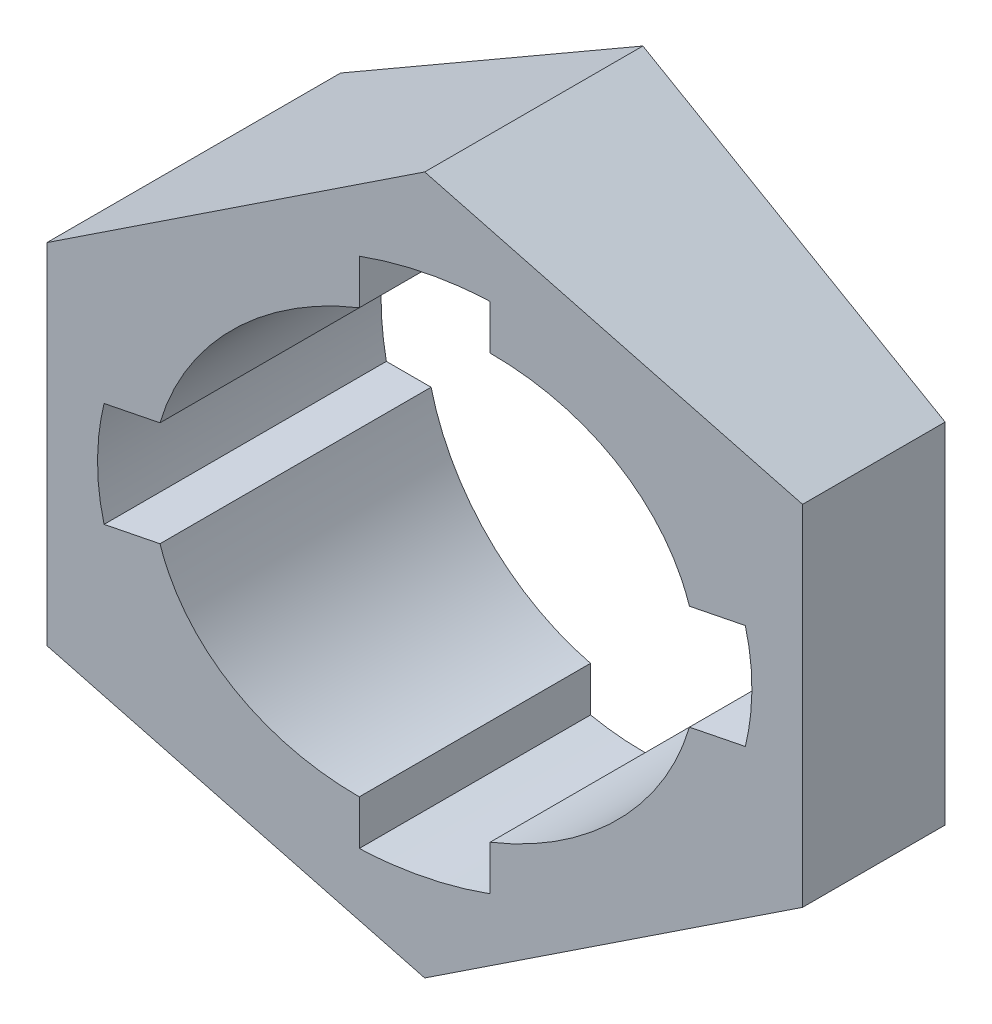
ISO-10303-21;
HEADER;
FILE_DESCRIPTION(('STEP AP214'),'2;1');
FILE_NAME('part.step','',(''),(''),'','','');
FILE_SCHEMA(('AUTOMOTIVE_DESIGN { 1 0 10303 214 1 1 1 1 }'));
ENDSEC;
DATA;
#1=APPLICATION_CONTEXT('core data for automotive mechanical design processes');
#2=APPLICATION_PROTOCOL_DEFINITION('international standard','automotive_design',2000,#1);
#3=PRODUCT_CONTEXT('',#1,'mechanical');
#4=PRODUCT('Part','Part','',(#3));
#5=PRODUCT_RELATED_PRODUCT_CATEGORY('part','',(#4));
#6=PRODUCT_DEFINITION_FORMATION('','',#4);
#7=PRODUCT_DEFINITION_CONTEXT('part definition',#1,'design');
#8=PRODUCT_DEFINITION('design','',#6,#7);
#9=PRODUCT_DEFINITION_SHAPE('','',#8);
#10=(LENGTH_UNIT() NAMED_UNIT(*) SI_UNIT(.MILLI.,.METRE.));
#11=(NAMED_UNIT(*) PLANE_ANGLE_UNIT() SI_UNIT($,.RADIAN.));
#12=(NAMED_UNIT(*) SI_UNIT($,.STERADIAN.) SOLID_ANGLE_UNIT());
#13=UNCERTAINTY_MEASURE_WITH_UNIT(LENGTH_MEASURE(1.E-05),#10,'distance_accuracy_value','');
#14=(GEOMETRIC_REPRESENTATION_CONTEXT(3) GLOBAL_UNCERTAINTY_ASSIGNED_CONTEXT((#13)) GLOBAL_UNIT_ASSIGNED_CONTEXT((#10,
#11,#12)) REPRESENTATION_CONTEXT('',''));
#15=CARTESIAN_POINT('',(0.,0.,0.));
#16=DIRECTION('',(0.,0.,1.));
#17=DIRECTION('',(1.,0.,0.));
#18=AXIS2_PLACEMENT_3D('',#15,#16,#17);
#19=CARTESIAN_POINT('',(0.,0.,0.));
#20=DIRECTION('',(0.,0.,-1.));
#21=DIRECTION('',(-1.,0.,0.));
#22=AXIS2_PLACEMENT_3D('',#19,#20,#21);
#23=PLANE('',#22);
#24=DIRECTION('',(0.,-1.,0.));
#25=VECTOR('',#24,1.);
#26=CARTESIAN_POINT('',(-34.0000000000001,0.,0.));
#27=LINE('',#26,#25);
#28=CARTESIAN_POINT('',(-34.,69.393876913398,0.));
#29=VERTEX_POINT('',#28);
#30=CARTESIAN_POINT('',(-34.,64.2693221990231,0.));
#31=VERTEX_POINT('',#30);
#32=EDGE_CURVE('E215',#29,#31,#27,.T.);
#33=ORIENTED_EDGE('',*,*,#32,.F.);
#34=CARTESIAN_POINT('',(-40.,39.9999999999999,0.));
#35=DIRECTION('',(0.,0.,-1.));
#36=DIRECTION('',(-1.,0.,0.));
#37=AXIS2_PLACEMENT_3D('',#34,#35,#36);
#38=CIRCLE('',#37,30.);
#39=CARTESIAN_POINT('',(-46.,69.393876913398,0.));
#40=VERTEX_POINT('',#39);
#41=EDGE_CURVE('E437',#40,#29,#38,.T.);
#42=ORIENTED_EDGE('',*,*,#41,.F.);
#43=DIRECTION('',(0.,-1.,0.));
#44=VECTOR('',#43,1.);
#45=CARTESIAN_POINT('',(-46.0000000000001,0.,0.));
#46=LINE('',#45,#44);
#47=CARTESIAN_POINT('',(-46.,64.2693221990231,0.));
#48=VERTEX_POINT('',#47);
#49=EDGE_CURVE('E434',#40,#48,#46,.T.);
#50=ORIENTED_EDGE('',*,*,#49,.T.);
#51=CARTESIAN_POINT('',(-40.,39.9999999999999,0.));
#52=DIRECTION('',(0.,0.,-1.));
#53=DIRECTION('',(-1.,0.,0.));
#54=AXIS2_PLACEMENT_3D('',#51,#52,#53);
#55=CIRCLE('',#54,25.);
#56=CARTESIAN_POINT('',(-64.2693221990232,45.9999999999999,0.));
#57=VERTEX_POINT('',#56);
#58=EDGE_CURVE('E431',#57,#48,#55,.T.);
#59=ORIENTED_EDGE('',*,*,#58,.F.);
#60=DIRECTION('',(1.,0.,0.));
#61=VECTOR('',#60,1.);
#62=CARTESIAN_POINT('',(0.,45.9999999999998,0.));
#63=LINE('',#62,#61);
#64=CARTESIAN_POINT('',(-69.3938769133981,45.9999999999999,0.));
#65=VERTEX_POINT('',#64);
#66=EDGE_CURVE('E428',#65,#57,#63,.T.);
#67=ORIENTED_EDGE('',*,*,#66,.F.);
#68=CARTESIAN_POINT('',(-40.,39.9999999999999,0.));
#69=DIRECTION('',(0.,0.,-1.));
#70=DIRECTION('',(-1.,0.,0.));
#71=AXIS2_PLACEMENT_3D('',#68,#69,#70);
#72=CIRCLE('',#71,30.);
#73=CARTESIAN_POINT('',(-69.3938769133981,33.9999999999999,0.));
#74=VERTEX_POINT('',#73);
#75=EDGE_CURVE('E425',#74,#65,#72,.T.);
#76=ORIENTED_EDGE('',*,*,#75,.F.);
#77=DIRECTION('',(1.,0.,0.));
#78=VECTOR('',#77,1.);
#79=CARTESIAN_POINT('',(0.,33.9999999999997,0.));
#80=LINE('',#79,#78);
#81=CARTESIAN_POINT('',(-64.2693221990232,33.9999999999999,0.));
#82=VERTEX_POINT('',#81);
#83=EDGE_CURVE('E422',#74,#82,#80,.T.);
#84=ORIENTED_EDGE('',*,*,#83,.T.);
#85=CARTESIAN_POINT('',(-40.,39.9999999999999,0.));
#86=DIRECTION('',(0.,0.,-1.));
#87=DIRECTION('',(-1.,0.,0.));
#88=AXIS2_PLACEMENT_3D('',#85,#86,#87);
#89=CIRCLE('',#88,25.);
#90=CARTESIAN_POINT('',(-46.,15.7306778009767,0.));
#91=VERTEX_POINT('',#90);
#92=EDGE_CURVE('E419',#91,#82,#89,.T.);
#93=ORIENTED_EDGE('',*,*,#92,.F.);
#94=DIRECTION('',(0.,1.,0.));
#95=VECTOR('',#94,1.);
#96=CARTESIAN_POINT('',(-46.,0.,0.));
#97=LINE('',#96,#95);
#98=CARTESIAN_POINT('',(-46.,10.6061230866017,0.));
#99=VERTEX_POINT('',#98);
#100=EDGE_CURVE('E416',#99,#91,#97,.T.);
#101=ORIENTED_EDGE('',*,*,#100,.F.);
#102=CARTESIAN_POINT('',(-40.,39.9999999999999,0.));
#103=DIRECTION('',(0.,0.,-1.));
#104=DIRECTION('',(-1.,0.,0.));
#105=AXIS2_PLACEMENT_3D('',#102,#103,#104);
#106=CIRCLE('',#105,30.);
#107=CARTESIAN_POINT('',(-34.,10.6061230866017,0.));
#108=VERTEX_POINT('',#107);
#109=EDGE_CURVE('E413',#108,#99,#106,.T.);
#110=ORIENTED_EDGE('',*,*,#109,.F.);
#111=DIRECTION('',(0.,1.,0.));
#112=VECTOR('',#111,1.);
#113=CARTESIAN_POINT('',(-34.0000000000001,1.84150550346205E-13,0.));
#114=LINE('',#113,#112);
#115=CARTESIAN_POINT('',(-34.,15.7306778009767,0.));
#116=VERTEX_POINT('',#115);
#117=EDGE_CURVE('E410',#108,#116,#114,.T.);
#118=ORIENTED_EDGE('',*,*,#117,.T.);
#119=CARTESIAN_POINT('',(-40.,39.9999999999999,0.));
#120=DIRECTION('',(0.,0.,-1.));
#121=DIRECTION('',(-1.,0.,0.));
#122=AXIS2_PLACEMENT_3D('',#119,#120,#121);
#123=CIRCLE('',#122,25.);
#124=CARTESIAN_POINT('',(-15.7306778009768,33.9999999999999,0.));
#125=VERTEX_POINT('',#124);
#126=EDGE_CURVE('E407',#125,#116,#123,.T.);
#127=ORIENTED_EDGE('',*,*,#126,.F.);
#128=DIRECTION('',(-1.,0.,0.));
#129=VECTOR('',#128,1.);
#130=CARTESIAN_POINT('',(0.,33.9999999999998,0.));
#131=LINE('',#130,#129);
#132=CARTESIAN_POINT('',(-10.6061230866019,33.9999999999999,0.));
#133=VERTEX_POINT('',#132);
#134=EDGE_CURVE('E404',#133,#125,#131,.T.);
#135=ORIENTED_EDGE('',*,*,#134,.F.);
#136=CARTESIAN_POINT('',(-40.,39.9999999999999,0.));
#137=DIRECTION('',(0.,0.,-1.));
#138=DIRECTION('',(-1.,0.,0.));
#139=AXIS2_PLACEMENT_3D('',#136,#137,#138);
#140=CIRCLE('',#139,30.);
#141=CARTESIAN_POINT('',(-10.6061230866019,45.9999999999999,0.));
#142=VERTEX_POINT('',#141);
#143=EDGE_CURVE('E401',#142,#133,#140,.T.);
#144=ORIENTED_EDGE('',*,*,#143,.F.);
#145=DIRECTION('',(-1.,0.,0.));
#146=VECTOR('',#145,1.);
#147=CARTESIAN_POINT('',(0.,45.9999999999999,0.));
#148=LINE('',#147,#146);
#149=CARTESIAN_POINT('',(-15.7306778009768,45.9999999999999,0.));
#150=VERTEX_POINT('',#149);
#151=EDGE_CURVE('E398',#142,#150,#148,.T.);
#152=ORIENTED_EDGE('',*,*,#151,.T.);
#153=CARTESIAN_POINT('',(-40.,39.9999999999999,0.));
#154=DIRECTION('',(0.,0.,-1.));
#155=DIRECTION('',(-1.,0.,0.));
#156=AXIS2_PLACEMENT_3D('',#153,#154,#155);
#157=CIRCLE('',#156,25.);
#158=EDGE_CURVE('E395',#31,#150,#157,.T.);
#159=ORIENTED_EDGE('',*,*,#158,.F.);
#160=EDGE_LOOP('',(#33,#42,#50,#59,#67,#76,#84,#93,#101,#110,#118,#127,#135,#144,#152,#159));
#161=FACE_BOUND('',#160,.T.);
#162=DIRECTION('',(0.,1.,0.));
#163=VECTOR('',#162,1.);
#164=CARTESIAN_POINT('',(-74.6410161513776,0.,0.));
#165=LINE('',#164,#163);
#166=CARTESIAN_POINT('',(-74.6410161513776,19.9999999999999,0.));
#167=VERTEX_POINT('',#166);
#168=CARTESIAN_POINT('',(-74.6410161513776,60.,0.));
#169=VERTEX_POINT('',#168);
#170=EDGE_CURVE('E354',#167,#169,#165,.T.);
#171=ORIENTED_EDGE('',*,*,#170,.T.);
#172=DIRECTION('',(0.866025403784439,0.5,0.));
#173=VECTOR('',#172,1.);
#174=CARTESIAN_POINT('',(-44.6410161513775,77.3205080756888,0.));
#175=LINE('',#174,#173);
#176=CARTESIAN_POINT('',(-40.,80.,0.));
#177=VERTEX_POINT('',#176);
#178=EDGE_CURVE('E363',#169,#177,#175,.T.);
#179=ORIENTED_EDGE('',*,*,#178,.T.);
#180=DIRECTION('',(0.866025403784438,-0.5,0.));
#181=VECTOR('',#180,1.);
#182=CARTESIAN_POINT('',(24.6410161513775,42.6794919243112,0.));
#183=LINE('',#182,#181);
#184=CARTESIAN_POINT('',(-5.35898384862239,59.9999999999999,0.));
#185=VERTEX_POINT('',#184);
#186=EDGE_CURVE('E385',#177,#185,#183,.T.);
#187=ORIENTED_EDGE('',*,*,#186,.T.);
#188=DIRECTION('',(0.,-1.,0.));
#189=VECTOR('',#188,1.);
#190=CARTESIAN_POINT('',(-5.3589838486224,0.,0.));
#191=LINE('',#190,#189);
#192=CARTESIAN_POINT('',(-5.3589838486224,19.9999999999999,0.));
#193=VERTEX_POINT('',#192);
#194=EDGE_CURVE('E382',#185,#193,#191,.T.);
#195=ORIENTED_EDGE('',*,*,#194,.T.);
#196=DIRECTION('',(-0.866025403784439,-0.5,0.));
#197=VECTOR('',#196,1.);
#198=CARTESIAN_POINT('',(-9.99999999999993,17.3205080756887,0.));
#199=LINE('',#198,#197);
#200=CARTESIAN_POINT('',(-39.9999999999998,0.,0.));
#201=VERTEX_POINT('',#200);
#202=EDGE_CURVE('E380',#193,#201,#199,.T.);
#203=ORIENTED_EDGE('',*,*,#202,.T.);
#204=DIRECTION('',(-0.866025403784439,0.5,0.));
#205=VECTOR('',#204,1.);
#206=CARTESIAN_POINT('',(-10.0000000000001,-17.3205080756889,0.));
#207=LINE('',#206,#205);
#208=EDGE_CURVE('E360',#201,#167,#207,.T.);
#209=ORIENTED_EDGE('',*,*,#208,.T.);
#210=EDGE_LOOP('',(#171,#179,#187,#195,#203,#209));
#211=FACE_BOUND('',#210,.T.);
#212=ADVANCED_FACE('F201',(#161,#211),#23,.T.);
#213=CARTESIAN_POINT('',(-80.,80.001,35.));
#214=DIRECTION('',(-0.242535625036333,0.,-0.970142500145332));
#215=DIRECTION('',(-0.970142500145332,0.,0.242535625036333));
#216=AXIS2_PLACEMENT_3D('',#213,#214,#215);
#217=PLANE('',#216);
#218=CARTESIAN_POINT('',(-40.,39.9999999999999,25.));
#219=DIRECTION('',(-0.242535625036333,0.,-0.970142500145332));
#220=DIRECTION('',(0.970142500145332,0.,-0.242535625036333));
#221=AXIS2_PLACEMENT_3D('',#218,#219,#220);
#222=ELLIPSE('',#221,30.9232921921325,30.);
#223=CARTESIAN_POINT('',(-46.,69.393876913398,26.5));
#224=VERTEX_POINT('',#223);
#225=CARTESIAN_POINT('',(-34.,69.393876913398,23.5));
#226=VERTEX_POINT('',#225);
#227=EDGE_CURVE('E511',#224,#226,#222,.T.);
#228=ORIENTED_EDGE('',*,*,#227,.T.);
#229=DIRECTION('',(0.,-1.,0.));
#230=VECTOR('',#229,1.);
#231=CARTESIAN_POINT('',(-34.,80.0009999999999,23.5));
#232=LINE('',#231,#230);
#233=CARTESIAN_POINT('',(-34.,64.2693221990231,23.5));
#234=VERTEX_POINT('',#233);
#235=EDGE_CURVE('E514',#226,#234,#232,.T.);
#236=ORIENTED_EDGE('',*,*,#235,.T.);
#237=CARTESIAN_POINT('',(-40.,39.9999999999999,25.));
#238=DIRECTION('',(-0.242535625036333,0.,-0.970142500145332));
#239=DIRECTION('',(0.970142500145332,0.,-0.242535625036333));
#240=AXIS2_PLACEMENT_3D('',#237,#238,#239);
#241=ELLIPSE('',#240,25.7694101601104,25.);
#242=CARTESIAN_POINT('',(-15.7306778009768,45.9999999999999,18.9326694502442));
#243=VERTEX_POINT('',#242);
#244=EDGE_CURVE('E443',#234,#243,#241,.T.);
#245=ORIENTED_EDGE('',*,*,#244,.T.);
#246=DIRECTION('',(-0.970142500145332,0.,0.242535625036333));
#247=VECTOR('',#246,1.);
#248=CARTESIAN_POINT('',(-80.,46.,35.));
#249=LINE('',#248,#247);
#250=CARTESIAN_POINT('',(-10.6061230866019,45.9999999999999,17.6515307716505));
#251=VERTEX_POINT('',#250);
#252=EDGE_CURVE('E475',#251,#243,#249,.T.);
#253=ORIENTED_EDGE('',*,*,#252,.F.);
#254=CARTESIAN_POINT('',(-40.,39.9999999999999,25.));
#255=DIRECTION('',(-0.242535625036333,0.,-0.970142500145332));
#256=DIRECTION('',(0.970142500145332,0.,-0.242535625036333));
#257=AXIS2_PLACEMENT_3D('',#254,#255,#256);
#258=ELLIPSE('',#257,30.9232921921325,30.);
#259=CARTESIAN_POINT('',(-10.6061230866019,33.9999999999999,17.6515307716505));
#260=VERTEX_POINT('',#259);
#261=EDGE_CURVE('E478',#251,#260,#258,.T.);
#262=ORIENTED_EDGE('',*,*,#261,.T.);
#263=DIRECTION('',(-0.970142500145332,0.,0.242535625036333));
#264=VECTOR('',#263,1.);
#265=CARTESIAN_POINT('',(-80.0000000000001,34.0000000000001,35.));
#266=LINE('',#265,#264);
#267=CARTESIAN_POINT('',(-15.7306778009768,33.9999999999999,18.9326694502442));
#268=VERTEX_POINT('',#267);
#269=EDGE_CURVE('E481',#260,#268,#266,.T.);
#270=ORIENTED_EDGE('',*,*,#269,.T.);
#271=CARTESIAN_POINT('',(-40.,39.9999999999999,25.));
#272=DIRECTION('',(-0.242535625036333,0.,-0.970142500145332));
#273=DIRECTION('',(0.970142500145332,0.,-0.242535625036333));
#274=AXIS2_PLACEMENT_3D('',#271,#272,#273);
#275=ELLIPSE('',#274,25.7694101601104,25.);
#276=CARTESIAN_POINT('',(-34.,15.7306778009767,23.5));
#277=VERTEX_POINT('',#276);
#278=EDGE_CURVE('E484',#268,#277,#275,.T.);
#279=ORIENTED_EDGE('',*,*,#278,.T.);
#280=DIRECTION('',(0.,1.,0.));
#281=VECTOR('',#280,1.);
#282=CARTESIAN_POINT('',(-33.9999999999997,80.0009999999997,23.4999999999999));
#283=LINE('',#282,#281);
#284=CARTESIAN_POINT('',(-34.,10.6061230866017,23.5));
#285=VERTEX_POINT('',#284);
#286=EDGE_CURVE('E487',#285,#277,#283,.T.);
#287=ORIENTED_EDGE('',*,*,#286,.F.);
#288=CARTESIAN_POINT('',(-40.,39.9999999999999,25.));
#289=DIRECTION('',(-0.242535625036333,0.,-0.970142500145332));
#290=DIRECTION('',(0.970142500145332,0.,-0.242535625036333));
#291=AXIS2_PLACEMENT_3D('',#288,#289,#290);
#292=ELLIPSE('',#291,30.9232921921325,30.);
#293=CARTESIAN_POINT('',(-46.,10.6061230866017,26.5));
#294=VERTEX_POINT('',#293);
#295=EDGE_CURVE('E489',#285,#294,#292,.T.);
#296=ORIENTED_EDGE('',*,*,#295,.T.);
#297=DIRECTION('',(0.,1.,0.));
#298=VECTOR('',#297,1.);
#299=CARTESIAN_POINT('',(-45.9999999999999,80.0009999999999,26.5));
#300=LINE('',#299,#298);
#301=CARTESIAN_POINT('',(-46.,15.7306778009767,26.5));
#302=VERTEX_POINT('',#301);
#303=EDGE_CURVE('E492',#294,#302,#300,.T.);
#304=ORIENTED_EDGE('',*,*,#303,.T.);
#305=CARTESIAN_POINT('',(-40.,39.9999999999999,25.));
#306=DIRECTION('',(-0.242535625036333,0.,-0.970142500145332));
#307=DIRECTION('',(0.970142500145332,0.,-0.242535625036333));
#308=AXIS2_PLACEMENT_3D('',#305,#306,#307);
#309=ELLIPSE('',#308,25.7694101601104,25.);
#310=CARTESIAN_POINT('',(-64.2693221990232,33.9999999999999,31.0673305497558));
#311=VERTEX_POINT('',#310);
#312=EDGE_CURVE('E495',#302,#311,#309,.T.);
#313=ORIENTED_EDGE('',*,*,#312,.T.);
#314=DIRECTION('',(0.970142500145332,0.,-0.242535625036333));
#315=VECTOR('',#314,1.);
#316=CARTESIAN_POINT('',(-80.0000000000001,33.9999999999999,35.));
#317=LINE('',#316,#315);
#318=CARTESIAN_POINT('',(-69.3938769133981,33.9999999999999,32.3484692283495));
#319=VERTEX_POINT('',#318);
#320=EDGE_CURVE('E498',#319,#311,#317,.T.);
#321=ORIENTED_EDGE('',*,*,#320,.F.);
#322=CARTESIAN_POINT('',(-40.,39.9999999999999,25.));
#323=DIRECTION('',(-0.242535625036333,0.,-0.970142500145332));
#324=DIRECTION('',(0.970142500145332,0.,-0.242535625036333));
#325=AXIS2_PLACEMENT_3D('',#322,#323,#324);
#326=ELLIPSE('',#325,30.9232921921324,30.);
#327=CARTESIAN_POINT('',(-69.3938769133981,45.9999999999999,32.3484692283495));
#328=VERTEX_POINT('',#327);
#329=EDGE_CURVE('E500',#319,#328,#326,.T.);
#330=ORIENTED_EDGE('',*,*,#329,.T.);
#331=DIRECTION('',(0.970142500145332,0.,-0.242535625036333));
#332=VECTOR('',#331,1.);
#333=CARTESIAN_POINT('',(-80.,45.9999999999999,35.));
#334=LINE('',#333,#332);
#335=CARTESIAN_POINT('',(-64.2693221990232,45.9999999999999,31.0673305497558));
#336=VERTEX_POINT('',#335);
#337=EDGE_CURVE('E503',#328,#336,#334,.T.);
#338=ORIENTED_EDGE('',*,*,#337,.T.);
#339=CARTESIAN_POINT('',(-40.,39.9999999999999,25.));
#340=DIRECTION('',(-0.242535625036333,0.,-0.970142500145332));
#341=DIRECTION('',(0.970142500145332,0.,-0.242535625036333));
#342=AXIS2_PLACEMENT_3D('',#339,#340,#341);
#343=ELLIPSE('',#342,25.7694101601104,25.);
#344=CARTESIAN_POINT('',(-46.,64.2693221990231,26.5));
#345=VERTEX_POINT('',#344);
#346=EDGE_CURVE('E506',#336,#345,#343,.T.);
#347=ORIENTED_EDGE('',*,*,#346,.T.);
#348=DIRECTION('',(0.,-1.,0.));
#349=VECTOR('',#348,1.);
#350=CARTESIAN_POINT('',(-46.,80.0009999999999,26.5));
#351=LINE('',#350,#349);
#352=EDGE_CURVE('E509',#224,#345,#351,.T.);
#353=ORIENTED_EDGE('',*,*,#352,.F.);
#354=EDGE_LOOP('',(#228,#236,#245,#253,#262,#270,#279,#287,#296,#304,#313,#321,#330,#338,#347,#353));
#355=FACE_BOUND('',#354,.T.);
#356=DIRECTION('',(0.846414739030318,0.488677777425221,-0.21160368475758));
#357=VECTOR('',#356,1.);
#358=CARTESIAN_POINT('',(-70.4473475699564,62.4212156843756,32.6118368924891));
#359=LINE('',#358,#357);
#360=CARTESIAN_POINT('',(-74.6410161513776,60.,33.6602540378444));
#361=VERTEX_POINT('',#360);
#362=CARTESIAN_POINT('',(-40.,80.,25.));
#363=VERTEX_POINT('',#362);
#364=EDGE_CURVE('E375',#361,#363,#359,.T.);
#365=ORIENTED_EDGE('',*,*,#364,.F.);
#366=DIRECTION('',(0.,1.,0.));
#367=VECTOR('',#366,1.);
#368=CARTESIAN_POINT('',(-74.6410161513776,80.001,33.6602540378444));
#369=LINE('',#368,#367);
#370=CARTESIAN_POINT('',(-74.6410161513776,19.9999999999999,33.6602540378444));
#371=VERTEX_POINT('',#370);
#372=EDGE_CURVE('E12',#371,#361,#369,.T.);
#373=ORIENTED_EDGE('',*,*,#372,.F.);
#374=DIRECTION('',(-0.846414739030318,0.488677777425221,0.21160368475758));
#375=VECTOR('',#374,1.);
#376=CARTESIAN_POINT('',(-103.538100694046,36.6837395395049,40.8845251735115));
#377=LINE('',#376,#375);
#378=CARTESIAN_POINT('',(-39.9999999999998,0.,24.9999999999999));
#379=VERTEX_POINT('',#378);
#380=EDGE_CURVE('E378',#379,#371,#377,.T.);
#381=ORIENTED_EDGE('',*,*,#380,.F.);
#382=DIRECTION('',(-0.846414739030318,-0.48867777742522,0.21160368475758));
#383=VECTOR('',#382,1.);
#384=CARTESIAN_POINT('',(-37.3574216940137,1.52569329631574,24.3393554235034));
#385=LINE('',#384,#383);
#386=CARTESIAN_POINT('',(-5.3589838486224,19.9999999999999,16.3397459621556));
#387=VERTEX_POINT('',#386);
#388=EDGE_CURVE('E208',#387,#379,#385,.T.);
#389=ORIENTED_EDGE('',*,*,#388,.F.);
#390=DIRECTION('',(0.,-1.,0.));
#391=VECTOR('',#390,1.);
#392=CARTESIAN_POINT('',(-5.35898384862238,80.001,16.3397459621556));
#393=LINE('',#392,#391);
#394=CARTESIAN_POINT('',(-5.35898384862238,59.9999999999999,16.3397459621556));
#395=VERTEX_POINT('',#394);
#396=EDGE_CURVE('E517',#395,#387,#393,.T.);
#397=ORIENTED_EDGE('',*,*,#396,.F.);
#398=DIRECTION('',(0.846414739030318,-0.488677777425221,-0.211603684757579));
#399=VECTOR('',#398,1.);
#400=CARTESIAN_POINT('',(-70.4481748181033,97.5792619275647,32.6120437045258));
#401=LINE('',#400,#399);
#402=EDGE_CURVE('E519',#363,#395,#401,.T.);
#403=ORIENTED_EDGE('',*,*,#402,.F.);
#404=EDGE_LOOP('',(#365,#373,#381,#389,#397,#403));
#405=FACE_BOUND('',#404,.T.);
#406=ADVANCED_FACE('F529',(#355,#405),#217,.F.);
#407=CARTESIAN_POINT('',(-34.0000000000001,0.,35.));
#408=DIRECTION('',(1.,0.,0.));
#409=DIRECTION('',(0.,1.,0.));
#410=AXIS2_PLACEMENT_3D('',#407,#408,#409);
#411=PLANE('',#410);
#412=DIRECTION('',(0.,0.,-1.));
#413=VECTOR('',#412,1.);
#414=CARTESIAN_POINT('',(-34.,69.393876913398,35.));
#415=LINE('',#414,#413);
#416=EDGE_CURVE('E441',#226,#29,#415,.T.);
#417=ORIENTED_EDGE('',*,*,#416,.T.);
#418=ORIENTED_EDGE('',*,*,#32,.T.);
#419=DIRECTION('',(0.,0.,-1.));
#420=VECTOR('',#419,1.);
#421=CARTESIAN_POINT('',(-34.,64.2693221990231,35.));
#422=LINE('',#421,#420);
#423=EDGE_CURVE('E440',#234,#31,#422,.T.);
#424=ORIENTED_EDGE('',*,*,#423,.F.);
#425=ORIENTED_EDGE('',*,*,#235,.F.);
#426=EDGE_LOOP('',(#417,#418,#424,#425));
#427=FACE_BOUND('',#426,.T.);
#428=ADVANCED_FACE('F547',(#427),#411,.F.);
#429=CARTESIAN_POINT('',(-40.,39.9999999999999,35.));
#430=DIRECTION('',(0.,0.,-1.));
#431=DIRECTION('',(-1.,0.,0.));
#432=AXIS2_PLACEMENT_3D('',#429,#430,#431);
#433=CYLINDRICAL_SURFACE('',#432,30.);
#434=DIRECTION('',(0.,0.,-1.));
#435=VECTOR('',#434,1.);
#436=CARTESIAN_POINT('',(-46.,69.393876913398,35.));
#437=LINE('',#436,#435);
#438=EDGE_CURVE('E444',#224,#40,#437,.T.);
#439=ORIENTED_EDGE('',*,*,#438,.T.);
#440=ORIENTED_EDGE('',*,*,#41,.T.);
#441=ORIENTED_EDGE('',*,*,#416,.F.);
#442=ORIENTED_EDGE('',*,*,#227,.F.);
#443=EDGE_LOOP('',(#439,#440,#441,#442));
#444=FACE_BOUND('',#443,.T.);
#445=ADVANCED_FACE('F560',(#444),#433,.F.);
#446=CARTESIAN_POINT('',(-46.0000000000001,0.,35.));
#447=DIRECTION('',(1.,0.,0.));
#448=DIRECTION('',(0.,1.,0.));
#449=AXIS2_PLACEMENT_3D('',#446,#447,#448);
#450=PLANE('',#449);
#451=ORIENTED_EDGE('',*,*,#352,.T.);
#452=DIRECTION('',(0.,0.,-1.));
#453=VECTOR('',#452,1.);
#454=CARTESIAN_POINT('',(-46.,64.2693221990231,35.));
#455=LINE('',#454,#453);
#456=EDGE_CURVE('E446',#345,#48,#455,.T.);
#457=ORIENTED_EDGE('',*,*,#456,.T.);
#458=ORIENTED_EDGE('',*,*,#49,.F.);
#459=ORIENTED_EDGE('',*,*,#438,.F.);
#460=EDGE_LOOP('',(#451,#457,#458,#459));
#461=FACE_BOUND('',#460,.T.);
#462=ADVANCED_FACE('F563',(#461),#450,.T.);
#463=CARTESIAN_POINT('',(-40.,39.9999999999999,35.));
#464=DIRECTION('',(0.,0.,-1.));
#465=DIRECTION('',(-1.,0.,0.));
#466=AXIS2_PLACEMENT_3D('',#463,#464,#465);
#467=CYLINDRICAL_SURFACE('',#466,25.);
#468=DIRECTION('',(0.,0.,-1.));
#469=VECTOR('',#468,1.);
#470=CARTESIAN_POINT('',(-64.2693221990232,45.9999999999999,35.));
#471=LINE('',#470,#469);
#472=EDGE_CURVE('E448',#336,#57,#471,.T.);
#473=ORIENTED_EDGE('',*,*,#472,.T.);
#474=ORIENTED_EDGE('',*,*,#58,.T.);
#475=ORIENTED_EDGE('',*,*,#456,.F.);
#476=ORIENTED_EDGE('',*,*,#346,.F.);
#477=EDGE_LOOP('',(#473,#474,#475,#476));
#478=FACE_BOUND('',#477,.T.);
#479=ADVANCED_FACE('F569',(#478),#467,.F.);
#480=CARTESIAN_POINT('',(0.,45.9999999999998,35.));
#481=DIRECTION('',(0.,1.,0.));
#482=DIRECTION('',(-1.,0.,0.));
#483=AXIS2_PLACEMENT_3D('',#480,#481,#482);
#484=PLANE('',#483);
#485=DIRECTION('',(0.,0.,-1.));
#486=VECTOR('',#485,1.);
#487=CARTESIAN_POINT('',(-69.3938769133981,45.9999999999999,35.));
#488=LINE('',#487,#486);
#489=EDGE_CURVE('E450',#328,#65,#488,.T.);
#490=ORIENTED_EDGE('',*,*,#489,.T.);
#491=ORIENTED_EDGE('',*,*,#66,.T.);
#492=ORIENTED_EDGE('',*,*,#472,.F.);
#493=ORIENTED_EDGE('',*,*,#337,.F.);
#494=EDGE_LOOP('',(#490,#491,#492,#493));
#495=FACE_BOUND('',#494,.T.);
#496=ADVANCED_FACE('F572',(#495),#484,.F.);
#497=CARTESIAN_POINT('',(-40.,39.9999999999999,35.));
#498=DIRECTION('',(0.,0.,-1.));
#499=DIRECTION('',(-1.,0.,0.));
#500=AXIS2_PLACEMENT_3D('',#497,#498,#499);
#501=CYLINDRICAL_SURFACE('',#500,30.);
#502=DIRECTION('',(0.,0.,-1.));
#503=VECTOR('',#502,1.);
#504=CARTESIAN_POINT('',(-69.3938769133981,33.9999999999999,35.));
#505=LINE('',#504,#503);
#506=EDGE_CURVE('E452',#319,#74,#505,.T.);
#507=ORIENTED_EDGE('',*,*,#506,.T.);
#508=ORIENTED_EDGE('',*,*,#75,.T.);
#509=ORIENTED_EDGE('',*,*,#489,.F.);
#510=ORIENTED_EDGE('',*,*,#329,.F.);
#511=EDGE_LOOP('',(#507,#508,#509,#510));
#512=FACE_BOUND('',#511,.T.);
#513=ADVANCED_FACE('F575',(#512),#501,.F.);
#514=CARTESIAN_POINT('',(0.,33.9999999999997,35.));
#515=DIRECTION('',(0.,1.,0.));
#516=DIRECTION('',(-1.,0.,0.));
#517=AXIS2_PLACEMENT_3D('',#514,#515,#516);
#518=PLANE('',#517);
#519=ORIENTED_EDGE('',*,*,#320,.T.);
#520=DIRECTION('',(0.,0.,-1.));
#521=VECTOR('',#520,1.);
#522=CARTESIAN_POINT('',(-64.2693221990232,33.9999999999999,35.));
#523=LINE('',#522,#521);
#524=EDGE_CURVE('E454',#311,#82,#523,.T.);
#525=ORIENTED_EDGE('',*,*,#524,.T.);
#526=ORIENTED_EDGE('',*,*,#83,.F.);
#527=ORIENTED_EDGE('',*,*,#506,.F.);
#528=EDGE_LOOP('',(#519,#525,#526,#527));
#529=FACE_BOUND('',#528,.T.);
#530=ADVANCED_FACE('F581',(#529),#518,.T.);
#531=CARTESIAN_POINT('',(-40.,39.9999999999999,35.));
#532=DIRECTION('',(0.,0.,-1.));
#533=DIRECTION('',(-1.,0.,0.));
#534=AXIS2_PLACEMENT_3D('',#531,#532,#533);
#535=CYLINDRICAL_SURFACE('',#534,25.);
#536=DIRECTION('',(0.,0.,-1.));
#537=VECTOR('',#536,1.);
#538=CARTESIAN_POINT('',(-46.,15.7306778009767,35.));
#539=LINE('',#538,#537);
#540=EDGE_CURVE('E456',#302,#91,#539,.T.);
#541=ORIENTED_EDGE('',*,*,#540,.T.);
#542=ORIENTED_EDGE('',*,*,#92,.T.);
#543=ORIENTED_EDGE('',*,*,#524,.F.);
#544=ORIENTED_EDGE('',*,*,#312,.F.);
#545=EDGE_LOOP('',(#541,#542,#543,#544));
#546=FACE_BOUND('',#545,.T.);
#547=ADVANCED_FACE('F585',(#546),#535,.F.);
#548=CARTESIAN_POINT('',(-46.,0.,35.));
#549=DIRECTION('',(-1.,0.,0.));
#550=DIRECTION('',(0.,-1.,0.));
#551=AXIS2_PLACEMENT_3D('',#548,#549,#550);
#552=PLANE('',#551);
#553=DIRECTION('',(0.,0.,-1.));
#554=VECTOR('',#553,1.);
#555=CARTESIAN_POINT('',(-46.,10.6061230866017,35.));
#556=LINE('',#555,#554);
#557=EDGE_CURVE('E458',#294,#99,#556,.T.);
#558=ORIENTED_EDGE('',*,*,#557,.T.);
#559=ORIENTED_EDGE('',*,*,#100,.T.);
#560=ORIENTED_EDGE('',*,*,#540,.F.);
#561=ORIENTED_EDGE('',*,*,#303,.F.);
#562=EDGE_LOOP('',(#558,#559,#560,#561));
#563=FACE_BOUND('',#562,.T.);
#564=ADVANCED_FACE('F588',(#563),#552,.F.);
#565=CARTESIAN_POINT('',(-40.,39.9999999999999,35.));
#566=DIRECTION('',(0.,0.,-1.));
#567=DIRECTION('',(-1.,0.,0.));
#568=AXIS2_PLACEMENT_3D('',#565,#566,#567);
#569=CYLINDRICAL_SURFACE('',#568,30.);
#570=DIRECTION('',(0.,0.,-1.));
#571=VECTOR('',#570,1.);
#572=CARTESIAN_POINT('',(-34.,10.6061230866017,35.));
#573=LINE('',#572,#571);
#574=EDGE_CURVE('E460',#285,#108,#573,.T.);
#575=ORIENTED_EDGE('',*,*,#574,.T.);
#576=ORIENTED_EDGE('',*,*,#109,.T.);
#577=ORIENTED_EDGE('',*,*,#557,.F.);
#578=ORIENTED_EDGE('',*,*,#295,.F.);
#579=EDGE_LOOP('',(#575,#576,#577,#578));
#580=FACE_BOUND('',#579,.T.);
#581=ADVANCED_FACE('F594',(#580),#569,.F.);
#582=CARTESIAN_POINT('',(-34.0000000000001,1.84150550346205E-13,35.));
#583=DIRECTION('',(-1.,0.,0.));
#584=DIRECTION('',(0.,-1.,0.));
#585=AXIS2_PLACEMENT_3D('',#582,#583,#584);
#586=PLANE('',#585);
#587=ORIENTED_EDGE('',*,*,#286,.T.);
#588=DIRECTION('',(0.,0.,-1.));
#589=VECTOR('',#588,1.);
#590=CARTESIAN_POINT('',(-34.,15.7306778009767,35.));
#591=LINE('',#590,#589);
#592=EDGE_CURVE('E462',#277,#116,#591,.T.);
#593=ORIENTED_EDGE('',*,*,#592,.T.);
#594=ORIENTED_EDGE('',*,*,#117,.F.);
#595=ORIENTED_EDGE('',*,*,#574,.F.);
#596=EDGE_LOOP('',(#587,#593,#594,#595));
#597=FACE_BOUND('',#596,.T.);
#598=ADVANCED_FACE('F598',(#597),#586,.T.);
#599=CARTESIAN_POINT('',(-40.,39.9999999999999,35.));
#600=DIRECTION('',(0.,0.,-1.));
#601=DIRECTION('',(-1.,0.,0.));
#602=AXIS2_PLACEMENT_3D('',#599,#600,#601);
#603=CYLINDRICAL_SURFACE('',#602,25.);
#604=DIRECTION('',(0.,0.,-1.));
#605=VECTOR('',#604,1.);
#606=CARTESIAN_POINT('',(-15.7306778009768,33.9999999999999,35.));
#607=LINE('',#606,#605);
#608=EDGE_CURVE('E464',#268,#125,#607,.T.);
#609=ORIENTED_EDGE('',*,*,#608,.T.);
#610=ORIENTED_EDGE('',*,*,#126,.T.);
#611=ORIENTED_EDGE('',*,*,#592,.F.);
#612=ORIENTED_EDGE('',*,*,#278,.F.);
#613=EDGE_LOOP('',(#609,#610,#611,#612));
#614=FACE_BOUND('',#613,.T.);
#615=ADVANCED_FACE('F601',(#614),#603,.F.);
#616=CARTESIAN_POINT('',(0.,33.9999999999998,35.));
#617=DIRECTION('',(0.,-1.,0.));
#618=DIRECTION('',(1.,0.,0.));
#619=AXIS2_PLACEMENT_3D('',#616,#617,#618);
#620=PLANE('',#619);
#621=DIRECTION('',(0.,0.,-1.));
#622=VECTOR('',#621,1.);
#623=CARTESIAN_POINT('',(-10.6061230866019,33.9999999999999,35.));
#624=LINE('',#623,#622);
#625=EDGE_CURVE('E466',#260,#133,#624,.T.);
#626=ORIENTED_EDGE('',*,*,#625,.T.);
#627=ORIENTED_EDGE('',*,*,#134,.T.);
#628=ORIENTED_EDGE('',*,*,#608,.F.);
#629=ORIENTED_EDGE('',*,*,#269,.F.);
#630=EDGE_LOOP('',(#626,#627,#628,#629));
#631=FACE_BOUND('',#630,.T.);
#632=ADVANCED_FACE('F605',(#631),#620,.F.);
#633=CARTESIAN_POINT('',(-40.,39.9999999999999,35.));
#634=DIRECTION('',(0.,0.,-1.));
#635=DIRECTION('',(-1.,0.,0.));
#636=AXIS2_PLACEMENT_3D('',#633,#634,#635);
#637=CYLINDRICAL_SURFACE('',#636,30.);
#638=DIRECTION('',(0.,0.,-1.));
#639=VECTOR('',#638,1.);
#640=CARTESIAN_POINT('',(-10.6061230866019,45.9999999999999,35.));
#641=LINE('',#640,#639);
#642=EDGE_CURVE('E468',#251,#142,#641,.T.);
#643=ORIENTED_EDGE('',*,*,#642,.T.);
#644=ORIENTED_EDGE('',*,*,#143,.T.);
#645=ORIENTED_EDGE('',*,*,#625,.F.);
#646=ORIENTED_EDGE('',*,*,#261,.F.);
#647=EDGE_LOOP('',(#643,#644,#645,#646));
#648=FACE_BOUND('',#647,.T.);
#649=ADVANCED_FACE('F608',(#648),#637,.F.);
#650=CARTESIAN_POINT('',(0.,45.9999999999999,35.));
#651=DIRECTION('',(0.,-1.,0.));
#652=DIRECTION('',(1.,0.,0.));
#653=AXIS2_PLACEMENT_3D('',#650,#651,#652);
#654=PLANE('',#653);
#655=ORIENTED_EDGE('',*,*,#252,.T.);
#656=DIRECTION('',(0.,0.,-1.));
#657=VECTOR('',#656,1.);
#658=CARTESIAN_POINT('',(-15.7306778009768,45.9999999999999,35.));
#659=LINE('',#658,#657);
#660=EDGE_CURVE('E470',#243,#150,#659,.T.);
#661=ORIENTED_EDGE('',*,*,#660,.T.);
#662=ORIENTED_EDGE('',*,*,#151,.F.);
#663=ORIENTED_EDGE('',*,*,#642,.F.);
#664=EDGE_LOOP('',(#655,#661,#662,#663));
#665=FACE_BOUND('',#664,.T.);
#666=ADVANCED_FACE('F611',(#665),#654,.T.);
#667=CARTESIAN_POINT('',(-40.,39.9999999999999,35.));
#668=DIRECTION('',(0.,0.,-1.));
#669=DIRECTION('',(-1.,0.,0.));
#670=AXIS2_PLACEMENT_3D('',#667,#668,#669);
#671=CYLINDRICAL_SURFACE('',#670,25.);
#672=ORIENTED_EDGE('',*,*,#423,.T.);
#673=ORIENTED_EDGE('',*,*,#158,.T.);
#674=ORIENTED_EDGE('',*,*,#660,.F.);
#675=ORIENTED_EDGE('',*,*,#244,.F.);
#676=EDGE_LOOP('',(#672,#673,#674,#675));
#677=FACE_BOUND('',#676,.T.);
#678=ADVANCED_FACE('F554',(#677),#671,.F.);
#679=CARTESIAN_POINT('',(-9.99999999999993,17.3205080756887,35.));
#680=DIRECTION('',(0.5,-0.866025403784439,0.));
#681=DIRECTION('',(0.866025403784439,0.5,0.));
#682=AXIS2_PLACEMENT_3D('',#679,#680,#681);
#683=PLANE('',#682);
#684=ORIENTED_EDGE('',*,*,#388,.T.);
#685=DIRECTION('',(0.,0.,-1.));
#686=VECTOR('',#685,1.);
#687=CARTESIAN_POINT('',(-39.9999999999998,0.,35.));
#688=LINE('',#687,#686);
#689=EDGE_CURVE('E388',#379,#201,#688,.T.);
#690=ORIENTED_EDGE('',*,*,#689,.T.);
#691=ORIENTED_EDGE('',*,*,#202,.F.);
#692=DIRECTION('',(0.,0.,-1.));
#693=VECTOR('',#692,1.);
#694=CARTESIAN_POINT('',(-5.3589838486224,19.9999999999999,35.));
#695=LINE('',#694,#693);
#696=EDGE_CURVE('E387',#387,#193,#695,.T.);
#697=ORIENTED_EDGE('',*,*,#696,.F.);
#698=EDGE_LOOP('',(#684,#690,#691,#697));
#699=FACE_BOUND('',#698,.T.);
#700=ADVANCED_FACE('F524',(#699),#683,.T.);
#701=CARTESIAN_POINT('',(24.6410161513775,42.6794919243112,35.));
#702=DIRECTION('',(0.5,0.866025403784438,0.));
#703=DIRECTION('',(-0.866025403784438,0.5,0.));
#704=AXIS2_PLACEMENT_3D('',#701,#702,#703);
#705=PLANE('',#704);
#706=ORIENTED_EDGE('',*,*,#402,.T.);
#707=DIRECTION('',(0.,0.,-1.));
#708=VECTOR('',#707,1.);
#709=CARTESIAN_POINT('',(-5.35898384862239,59.9999999999999,35.));
#710=LINE('',#709,#708);
#711=EDGE_CURVE('E223',#395,#185,#710,.T.);
#712=ORIENTED_EDGE('',*,*,#711,.T.);
#713=ORIENTED_EDGE('',*,*,#186,.F.);
#714=DIRECTION('',(0.,0.,-1.));
#715=VECTOR('',#714,1.);
#716=CARTESIAN_POINT('',(-40.,80.,35.));
#717=LINE('',#716,#715);
#718=EDGE_CURVE('E366',#363,#177,#717,.T.);
#719=ORIENTED_EDGE('',*,*,#718,.F.);
#720=EDGE_LOOP('',(#706,#712,#713,#719));
#721=FACE_BOUND('',#720,.T.);
#722=ADVANCED_FACE('F679',(#721),#705,.T.);
#723=CARTESIAN_POINT('',(-5.3589838486224,0.,35.));
#724=DIRECTION('',(1.,0.,0.));
#725=DIRECTION('',(0.,1.,0.));
#726=AXIS2_PLACEMENT_3D('',#723,#724,#725);
#727=PLANE('',#726);
#728=ORIENTED_EDGE('',*,*,#396,.T.);
#729=ORIENTED_EDGE('',*,*,#696,.T.);
#730=ORIENTED_EDGE('',*,*,#194,.F.);
#731=ORIENTED_EDGE('',*,*,#711,.F.);
#732=EDGE_LOOP('',(#728,#729,#730,#731));
#733=FACE_BOUND('',#732,.T.);
#734=ADVANCED_FACE('F540',(#733),#727,.T.);
#735=CARTESIAN_POINT('',(-74.6410161513776,0.,35.));
#736=DIRECTION('',(-1.,0.,0.));
#737=DIRECTION('',(0.,0.,1.));
#738=AXIS2_PLACEMENT_3D('',#735,#736,#737);
#739=PLANE('',#738);
#740=ORIENTED_EDGE('',*,*,#372,.T.);
#741=DIRECTION('',(0.,0.,-1.));
#742=VECTOR('',#741,1.);
#743=CARTESIAN_POINT('',(-74.6410161513776,60.,35.));
#744=LINE('',#743,#742);
#745=EDGE_CURVE('E349',#361,#169,#744,.T.);
#746=ORIENTED_EDGE('',*,*,#745,.T.);
#747=ORIENTED_EDGE('',*,*,#170,.F.);
#748=DIRECTION('',(0.,0.,-1.));
#749=VECTOR('',#748,1.);
#750=CARTESIAN_POINT('',(-74.6410161513776,19.9999999999999,35.));
#751=LINE('',#750,#749);
#752=EDGE_CURVE('E359',#371,#167,#751,.T.);
#753=ORIENTED_EDGE('',*,*,#752,.F.);
#754=EDGE_LOOP('',(#740,#746,#747,#753));
#755=FACE_BOUND('',#754,.T.);
#756=ADVANCED_FACE('F351',(#755),#739,.T.);
#757=CARTESIAN_POINT('',(-10.0000000000001,-17.3205080756889,35.));
#758=DIRECTION('',(-0.5,-0.866025403784439,0.));
#759=DIRECTION('',(0.866025403784439,-0.5,0.));
#760=AXIS2_PLACEMENT_3D('',#757,#758,#759);
#761=PLANE('',#760);
#762=ORIENTED_EDGE('',*,*,#380,.T.);
#763=ORIENTED_EDGE('',*,*,#752,.T.);
#764=ORIENTED_EDGE('',*,*,#208,.F.);
#765=ORIENTED_EDGE('',*,*,#689,.F.);
#766=EDGE_LOOP('',(#762,#763,#764,#765));
#767=FACE_BOUND('',#766,.T.);
#768=ADVANCED_FACE('F532',(#767),#761,.T.);
#769=CARTESIAN_POINT('',(-44.6410161513775,77.3205080756888,35.));
#770=DIRECTION('',(-0.5,0.866025403784439,0.));
#771=DIRECTION('',(-0.866025403784439,-0.5,0.));
#772=AXIS2_PLACEMENT_3D('',#769,#770,#771);
#773=PLANE('',#772);
#774=ORIENTED_EDGE('',*,*,#364,.T.);
#775=ORIENTED_EDGE('',*,*,#718,.T.);
#776=ORIENTED_EDGE('',*,*,#178,.F.);
#777=ORIENTED_EDGE('',*,*,#745,.F.);
#778=EDGE_LOOP('',(#774,#775,#776,#777));
#779=FACE_BOUND('',#778,.T.);
#780=ADVANCED_FACE('F364',(#779),#773,.T.);
#781=CLOSED_SHELL('',(#212,#406,#428,#445,#462,#479,#496,#513,#530,#547,#564,#581,#598,#615,
#632,#649,#666,#678,#700,#722,#734,#756,#768,#780));
#782=MANIFOLD_SOLID_BREP('B2',#781);
#783=ADVANCED_BREP_SHAPE_REPRESENTATION('',(#18,#782),#14);
#784=SHAPE_DEFINITION_REPRESENTATION(#9,#783);
ENDSEC;
END-ISO-10303-21;
